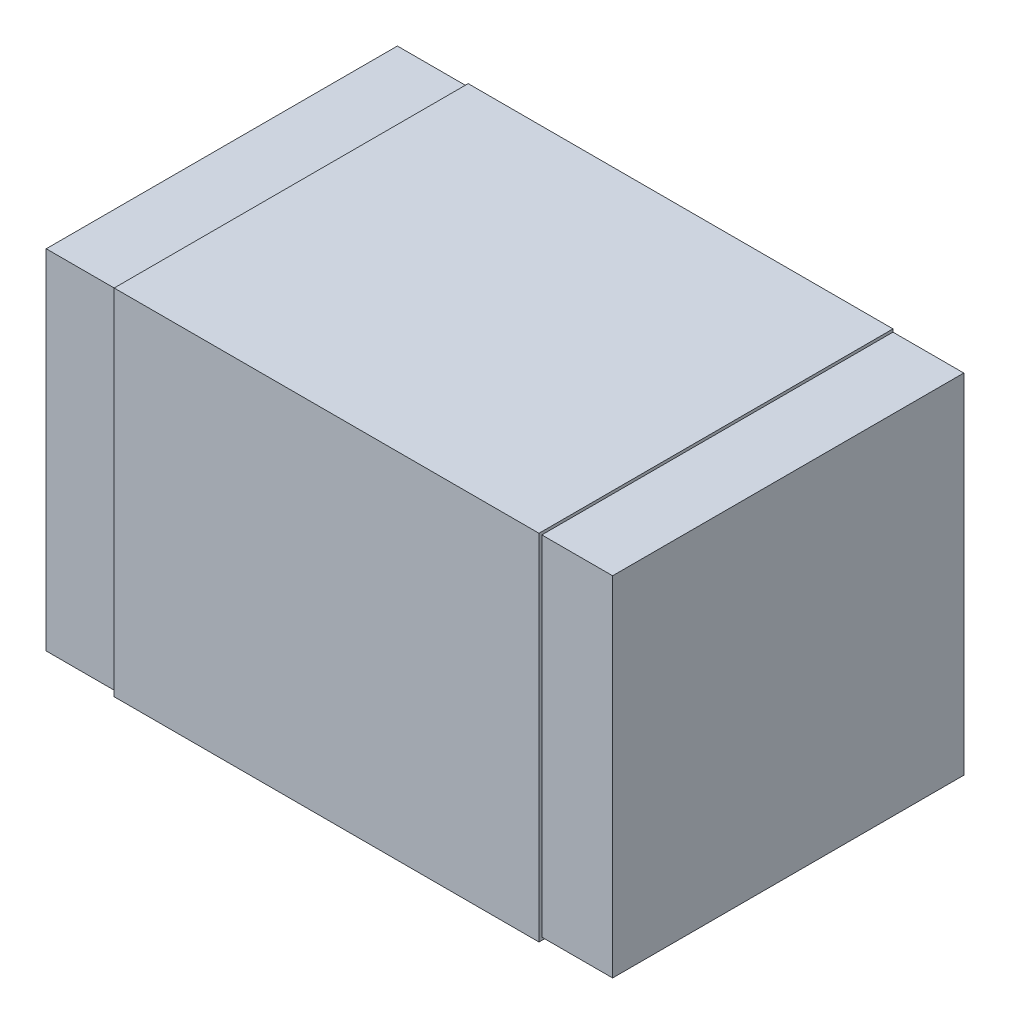
ISO-10303-21;
HEADER;
FILE_DESCRIPTION(('STEP AP214'),'2;1');
FILE_NAME('part.step','',(''),(''),'','','');
FILE_SCHEMA(('AUTOMOTIVE_DESIGN { 1 0 10303 214 1 1 1 1 }'));
ENDSEC;
DATA;
#1=APPLICATION_CONTEXT('core data for automotive mechanical design processes');
#2=APPLICATION_PROTOCOL_DEFINITION('international standard','automotive_design',2000,#1);
#3=PRODUCT_CONTEXT('',#1,'mechanical');
#4=PRODUCT('Part','Part','',(#3));
#5=PRODUCT_RELATED_PRODUCT_CATEGORY('part','',(#4));
#6=PRODUCT_DEFINITION_FORMATION('','',#4);
#7=PRODUCT_DEFINITION_CONTEXT('part definition',#1,'design');
#8=PRODUCT_DEFINITION('design','',#6,#7);
#9=PRODUCT_DEFINITION_SHAPE('','',#8);
#10=(LENGTH_UNIT() NAMED_UNIT(*) SI_UNIT(.MILLI.,.METRE.));
#11=(NAMED_UNIT(*) PLANE_ANGLE_UNIT() SI_UNIT($,.RADIAN.));
#12=(NAMED_UNIT(*) SI_UNIT($,.STERADIAN.) SOLID_ANGLE_UNIT());
#13=UNCERTAINTY_MEASURE_WITH_UNIT(LENGTH_MEASURE(1.E-05),#10,'distance_accuracy_value','');
#14=(GEOMETRIC_REPRESENTATION_CONTEXT(3) GLOBAL_UNCERTAINTY_ASSIGNED_CONTEXT((#13)) GLOBAL_UNIT_ASSIGNED_CONTEXT((#10,
#11,#12)) REPRESENTATION_CONTEXT('',''));
#15=CARTESIAN_POINT('',(0.,0.,0.));
#16=DIRECTION('',(0.,0.,1.));
#17=DIRECTION('',(1.,0.,0.));
#18=AXIS2_PLACEMENT_3D('',#15,#16,#17);
#19=CARTESIAN_POINT('',(-0.75,0.625,1.25));
#20=DIRECTION('',(1.,0.,0.));
#21=DIRECTION('',(0.,1.,0.));
#22=AXIS2_PLACEMENT_3D('',#19,#20,#21);
#23=PLANE('',#22);
#24=DIRECTION('',(0.,0.,-1.));
#25=VECTOR('',#24,1.);
#26=CARTESIAN_POINT('',(-0.75,0.615,1.24));
#27=LINE('',#26,#25);
#28=CARTESIAN_POINT('',(-0.75,0.615,1.24));
#29=VERTEX_POINT('',#28);
#30=CARTESIAN_POINT('',(-0.75,0.615,0.));
#31=VERTEX_POINT('',#30);
#32=EDGE_CURVE('E142',#29,#31,#27,.T.);
#33=ORIENTED_EDGE('',*,*,#32,.F.);
#34=DIRECTION('',(0.,-1.,0.));
#35=VECTOR('',#34,1.);
#36=CARTESIAN_POINT('',(-0.75,0.615,1.24));
#37=LINE('',#36,#35);
#38=CARTESIAN_POINT('',(-0.75,-0.615,1.24));
#39=VERTEX_POINT('',#38);
#40=EDGE_CURVE('E135',#29,#39,#37,.T.);
#41=ORIENTED_EDGE('',*,*,#40,.T.);
#42=DIRECTION('',(0.,0.,-1.));
#43=VECTOR('',#42,1.);
#44=CARTESIAN_POINT('',(-0.75,-0.615,1.24));
#45=LINE('',#44,#43);
#46=CARTESIAN_POINT('',(-0.75,-0.615,0.));
#47=VERTEX_POINT('',#46);
#48=EDGE_CURVE('E121',#39,#47,#45,.T.);
#49=ORIENTED_EDGE('',*,*,#48,.T.);
#50=DIRECTION('',(0.,-1.,0.));
#51=VECTOR('',#50,1.);
#52=CARTESIAN_POINT('',(-0.75,0.625,0.));
#53=LINE('',#52,#51);
#54=CARTESIAN_POINT('',(-0.75,-0.625,0.));
#55=VERTEX_POINT('',#54);
#56=EDGE_CURVE('E202',#47,#55,#53,.T.);
#57=ORIENTED_EDGE('',*,*,#56,.T.);
#58=DIRECTION('',(0.,0.,-1.));
#59=VECTOR('',#58,1.);
#60=CARTESIAN_POINT('',(-0.75,-0.625,1.25));
#61=LINE('',#60,#59);
#62=CARTESIAN_POINT('',(-0.75,-0.625,1.25));
#63=VERTEX_POINT('',#62);
#64=EDGE_CURVE('E208',#63,#55,#61,.T.);
#65=ORIENTED_EDGE('',*,*,#64,.F.);
#66=DIRECTION('',(0.,-1.,0.));
#67=VECTOR('',#66,1.);
#68=CARTESIAN_POINT('',(-0.75,0.625,1.25));
#69=LINE('',#68,#67);
#70=CARTESIAN_POINT('',(-0.75,0.625,1.25));
#71=VERTEX_POINT('',#70);
#72=EDGE_CURVE('E192',#71,#63,#69,.T.);
#73=ORIENTED_EDGE('',*,*,#72,.F.);
#74=DIRECTION('',(0.,0.,-1.));
#75=VECTOR('',#74,1.);
#76=CARTESIAN_POINT('',(-0.75,0.625,1.25));
#77=LINE('',#76,#75);
#78=CARTESIAN_POINT('',(-0.75,0.625,0.));
#79=VERTEX_POINT('',#78);
#80=EDGE_CURVE('E42',#71,#79,#77,.T.);
#81=ORIENTED_EDGE('',*,*,#80,.T.);
#82=EDGE_CURVE('E203',#79,#31,#53,.T.);
#83=ORIENTED_EDGE('',*,*,#82,.T.);
#84=EDGE_LOOP('',(#33,#41,#49,#57,#65,#73,#81,#83));
#85=FACE_BOUND('',#84,.T.);
#86=ADVANCED_FACE('F34',(#85),#23,.F.);
#87=CARTESIAN_POINT('',(0.75,0.625,1.25));
#88=DIRECTION('',(-1.,0.,0.));
#89=DIRECTION('',(0.,-1.,0.));
#90=AXIS2_PLACEMENT_3D('',#87,#88,#89);
#91=PLANE('',#90);
#92=DIRECTION('',(0.,0.,-1.));
#93=VECTOR('',#92,1.);
#94=CARTESIAN_POINT('',(0.75,-0.615,1.24));
#95=LINE('',#94,#93);
#96=CARTESIAN_POINT('',(0.75,-0.615,1.24));
#97=VERTEX_POINT('',#96);
#98=CARTESIAN_POINT('',(0.75,-0.615,0.));
#99=VERTEX_POINT('',#98);
#100=EDGE_CURVE('E178',#97,#99,#95,.T.);
#101=ORIENTED_EDGE('',*,*,#100,.F.);
#102=DIRECTION('',(0.,1.,0.));
#103=VECTOR('',#102,1.);
#104=CARTESIAN_POINT('',(0.75,0.615,1.24));
#105=LINE('',#104,#103);
#106=CARTESIAN_POINT('',(0.75,0.615,1.24));
#107=VERTEX_POINT('',#106);
#108=EDGE_CURVE('E158',#97,#107,#105,.T.);
#109=ORIENTED_EDGE('',*,*,#108,.T.);
#110=DIRECTION('',(0.,0.,-1.));
#111=VECTOR('',#110,1.);
#112=CARTESIAN_POINT('',(0.75,0.615,1.24));
#113=LINE('',#112,#111);
#114=CARTESIAN_POINT('',(0.75,0.615,0.));
#115=VERTEX_POINT('',#114);
#116=EDGE_CURVE('E171',#107,#115,#113,.T.);
#117=ORIENTED_EDGE('',*,*,#116,.T.);
#118=DIRECTION('',(0.,1.,0.));
#119=VECTOR('',#118,1.);
#120=CARTESIAN_POINT('',(0.75,0.625,0.));
#121=LINE('',#120,#119);
#122=CARTESIAN_POINT('',(0.75,0.625,0.));
#123=VERTEX_POINT('',#122);
#124=EDGE_CURVE('E180',#115,#123,#121,.T.);
#125=ORIENTED_EDGE('',*,*,#124,.T.);
#126=DIRECTION('',(0.,0.,-1.));
#127=VECTOR('',#126,1.);
#128=CARTESIAN_POINT('',(0.75,0.625,1.25));
#129=LINE('',#128,#127);
#130=CARTESIAN_POINT('',(0.75,0.625,1.25));
#131=VERTEX_POINT('',#130);
#132=EDGE_CURVE('E11',#131,#123,#129,.T.);
#133=ORIENTED_EDGE('',*,*,#132,.F.);
#134=DIRECTION('',(0.,1.,0.));
#135=VECTOR('',#134,1.);
#136=CARTESIAN_POINT('',(0.75,0.625,1.25));
#137=LINE('',#136,#135);
#138=CARTESIAN_POINT('',(0.75,-0.625,1.25));
#139=VERTEX_POINT('',#138);
#140=EDGE_CURVE('E186',#139,#131,#137,.T.);
#141=ORIENTED_EDGE('',*,*,#140,.F.);
#142=DIRECTION('',(0.,0.,-1.));
#143=VECTOR('',#142,1.);
#144=CARTESIAN_POINT('',(0.75,-0.625,1.25));
#145=LINE('',#144,#143);
#146=CARTESIAN_POINT('',(0.75,-0.625,0.));
#147=VERTEX_POINT('',#146);
#148=EDGE_CURVE('E196',#139,#147,#145,.T.);
#149=ORIENTED_EDGE('',*,*,#148,.T.);
#150=EDGE_CURVE('E197',#147,#99,#121,.T.);
#151=ORIENTED_EDGE('',*,*,#150,.T.);
#152=EDGE_LOOP('',(#101,#109,#117,#125,#133,#141,#149,#151));
#153=FACE_BOUND('',#152,.T.);
#154=ADVANCED_FACE('F36',(#153),#91,.F.);
#155=CARTESIAN_POINT('',(-0.75,0.625,1.25));
#156=DIRECTION('',(0.,-1.,0.));
#157=DIRECTION('',(0.,0.,-1.));
#158=AXIS2_PLACEMENT_3D('',#155,#156,#157);
#159=PLANE('',#158);
#160=DIRECTION('',(-1.,0.,0.));
#161=VECTOR('',#160,1.);
#162=CARTESIAN_POINT('',(-0.75,0.625,0.));
#163=LINE('',#162,#161);
#164=EDGE_CURVE('E200',#123,#79,#163,.T.);
#165=ORIENTED_EDGE('',*,*,#164,.T.);
#166=ORIENTED_EDGE('',*,*,#80,.F.);
#167=DIRECTION('',(-1.,0.,0.));
#168=VECTOR('',#167,1.);
#169=CARTESIAN_POINT('',(-0.75,0.625,1.25));
#170=LINE('',#169,#168);
#171=EDGE_CURVE('E189',#131,#71,#170,.T.);
#172=ORIENTED_EDGE('',*,*,#171,.F.);
#173=ORIENTED_EDGE('',*,*,#132,.T.);
#174=EDGE_LOOP('',(#165,#166,#172,#173));
#175=FACE_BOUND('',#174,.T.);
#176=ADVANCED_FACE('F236',(#175),#159,.F.);
#177=CARTESIAN_POINT('',(-0.75,-0.625,1.25));
#178=DIRECTION('',(0.,1.,0.));
#179=DIRECTION('',(0.,0.,1.));
#180=AXIS2_PLACEMENT_3D('',#177,#178,#179);
#181=PLANE('',#180);
#182=DIRECTION('',(1.,0.,0.));
#183=VECTOR('',#182,1.);
#184=CARTESIAN_POINT('',(-0.75,-0.625,0.));
#185=LINE('',#184,#183);
#186=EDGE_CURVE('E190',#55,#147,#185,.T.);
#187=ORIENTED_EDGE('',*,*,#186,.T.);
#188=ORIENTED_EDGE('',*,*,#148,.F.);
#189=DIRECTION('',(1.,0.,0.));
#190=VECTOR('',#189,1.);
#191=CARTESIAN_POINT('',(-0.75,-0.625,1.25));
#192=LINE('',#191,#190);
#193=EDGE_CURVE('E194',#63,#139,#192,.T.);
#194=ORIENTED_EDGE('',*,*,#193,.F.);
#195=ORIENTED_EDGE('',*,*,#64,.T.);
#196=EDGE_LOOP('',(#187,#188,#194,#195));
#197=FACE_BOUND('',#196,.T.);
#198=ADVANCED_FACE('F230',(#197),#181,.F.);
#199=CARTESIAN_POINT('',(0.,0.,1.25));
#200=DIRECTION('',(0.,0.,1.));
#201=DIRECTION('',(1.,0.,0.));
#202=AXIS2_PLACEMENT_3D('',#199,#200,#201);
#203=PLANE('',#202);
#204=ORIENTED_EDGE('',*,*,#140,.T.);
#205=ORIENTED_EDGE('',*,*,#171,.T.);
#206=ORIENTED_EDGE('',*,*,#72,.T.);
#207=ORIENTED_EDGE('',*,*,#193,.T.);
#208=EDGE_LOOP('',(#204,#205,#206,#207));
#209=FACE_BOUND('',#208,.T.);
#210=ADVANCED_FACE('F234',(#209),#203,.T.);
#211=CARTESIAN_POINT('',(0.,0.,0.));
#212=DIRECTION('',(0.,0.,1.));
#213=DIRECTION('',(1.,0.,0.));
#214=AXIS2_PLACEMENT_3D('',#211,#212,#213);
#215=PLANE('',#214);
#216=ORIENTED_EDGE('',*,*,#150,.F.);
#217=ORIENTED_EDGE('',*,*,#186,.F.);
#218=ORIENTED_EDGE('',*,*,#56,.F.);
#219=DIRECTION('',(-1.,0.,0.));
#220=VECTOR('',#219,1.);
#221=CARTESIAN_POINT('',(-0.75,-0.615,0.));
#222=LINE('',#221,#220);
#223=CARTESIAN_POINT('',(-1.,-0.615,0.));
#224=VERTEX_POINT('',#223);
#225=EDGE_CURVE('E49',#47,#224,#222,.T.);
#226=ORIENTED_EDGE('',*,*,#225,.T.);
#227=DIRECTION('',(0.,1.,0.));
#228=VECTOR('',#227,1.);
#229=CARTESIAN_POINT('',(-1.,0.615,0.));
#230=LINE('',#229,#228);
#231=CARTESIAN_POINT('',(-1.,0.615,0.));
#232=VERTEX_POINT('',#231);
#233=EDGE_CURVE('E146',#224,#232,#230,.T.);
#234=ORIENTED_EDGE('',*,*,#233,.T.);
#235=DIRECTION('',(1.,0.,0.));
#236=VECTOR('',#235,1.);
#237=CARTESIAN_POINT('',(-0.75,0.615,0.));
#238=LINE('',#237,#236);
#239=EDGE_CURVE('E143',#232,#31,#238,.T.);
#240=ORIENTED_EDGE('',*,*,#239,.T.);
#241=ORIENTED_EDGE('',*,*,#82,.F.);
#242=ORIENTED_EDGE('',*,*,#164,.F.);
#243=ORIENTED_EDGE('',*,*,#124,.F.);
#244=DIRECTION('',(1.,0.,0.));
#245=VECTOR('',#244,1.);
#246=CARTESIAN_POINT('',(0.75,0.615,0.));
#247=LINE('',#246,#245);
#248=CARTESIAN_POINT('',(1.,0.615,0.));
#249=VERTEX_POINT('',#248);
#250=EDGE_CURVE('E57',#115,#249,#247,.T.);
#251=ORIENTED_EDGE('',*,*,#250,.T.);
#252=DIRECTION('',(0.,-1.,0.));
#253=VECTOR('',#252,1.);
#254=CARTESIAN_POINT('',(1.,0.615,0.));
#255=LINE('',#254,#253);
#256=CARTESIAN_POINT('',(1.,-0.615,0.));
#257=VERTEX_POINT('',#256);
#258=EDGE_CURVE('E173',#249,#257,#255,.T.);
#259=ORIENTED_EDGE('',*,*,#258,.T.);
#260=DIRECTION('',(-1.,0.,0.));
#261=VECTOR('',#260,1.);
#262=CARTESIAN_POINT('',(0.75,-0.615,0.));
#263=LINE('',#262,#261);
#264=EDGE_CURVE('E162',#257,#99,#263,.T.);
#265=ORIENTED_EDGE('',*,*,#264,.T.);
#266=EDGE_LOOP('',(#216,#217,#218,#226,#234,#240,#241,#242,#243,#251,#259,#265));
#267=FACE_BOUND('',#266,.T.);
#268=ADVANCED_FACE('F219',(#267),#215,.F.);
#269=CARTESIAN_POINT('',(0.75,-0.615,1.24));
#270=DIRECTION('',(0.,-1.,0.));
#271=DIRECTION('',(1.,0.,0.));
#272=AXIS2_PLACEMENT_3D('',#269,#270,#271);
#273=PLANE('',#272);
#274=ORIENTED_EDGE('',*,*,#264,.F.);
#275=DIRECTION('',(0.,0.,-1.));
#276=VECTOR('',#275,1.);
#277=CARTESIAN_POINT('',(1.,-0.615,1.24));
#278=LINE('',#277,#276);
#279=CARTESIAN_POINT('',(1.,-0.615,1.24));
#280=VERTEX_POINT('',#279);
#281=EDGE_CURVE('E181',#280,#257,#278,.T.);
#282=ORIENTED_EDGE('',*,*,#281,.F.);
#283=DIRECTION('',(-1.,0.,0.));
#284=VECTOR('',#283,1.);
#285=CARTESIAN_POINT('',(0.75,-0.615,1.24));
#286=LINE('',#285,#284);
#287=EDGE_CURVE('E168',#280,#97,#286,.T.);
#288=ORIENTED_EDGE('',*,*,#287,.T.);
#289=ORIENTED_EDGE('',*,*,#100,.T.);
#290=EDGE_LOOP('',(#274,#282,#288,#289));
#291=FACE_BOUND('',#290,.T.);
#292=ADVANCED_FACE('F243',(#291),#273,.T.);
#293=CARTESIAN_POINT('',(1.,0.615,1.24));
#294=DIRECTION('',(1.,0.,0.));
#295=DIRECTION('',(0.,1.,0.));
#296=AXIS2_PLACEMENT_3D('',#293,#294,#295);
#297=PLANE('',#296);
#298=ORIENTED_EDGE('',*,*,#258,.F.);
#299=DIRECTION('',(0.,0.,-1.));
#300=VECTOR('',#299,1.);
#301=CARTESIAN_POINT('',(1.,0.615,1.24));
#302=LINE('',#301,#300);
#303=CARTESIAN_POINT('',(1.,0.615,1.24));
#304=VERTEX_POINT('',#303);
#305=EDGE_CURVE('E183',#304,#249,#302,.T.);
#306=ORIENTED_EDGE('',*,*,#305,.F.);
#307=DIRECTION('',(0.,-1.,0.));
#308=VECTOR('',#307,1.);
#309=CARTESIAN_POINT('',(1.,0.615,1.24));
#310=LINE('',#309,#308);
#311=EDGE_CURVE('E165',#304,#280,#310,.T.);
#312=ORIENTED_EDGE('',*,*,#311,.T.);
#313=ORIENTED_EDGE('',*,*,#281,.T.);
#314=EDGE_LOOP('',(#298,#306,#312,#313));
#315=FACE_BOUND('',#314,.T.);
#316=ADVANCED_FACE('F250',(#315),#297,.T.);
#317=CARTESIAN_POINT('',(0.75,0.615,1.24));
#318=DIRECTION('',(0.,1.,0.));
#319=DIRECTION('',(-1.,0.,0.));
#320=AXIS2_PLACEMENT_3D('',#317,#318,#319);
#321=PLANE('',#320);
#322=ORIENTED_EDGE('',*,*,#250,.F.);
#323=ORIENTED_EDGE('',*,*,#116,.F.);
#324=DIRECTION('',(1.,0.,0.));
#325=VECTOR('',#324,1.);
#326=CARTESIAN_POINT('',(0.75,0.615,1.24));
#327=LINE('',#326,#325);
#328=EDGE_CURVE('E161',#107,#304,#327,.T.);
#329=ORIENTED_EDGE('',*,*,#328,.T.);
#330=ORIENTED_EDGE('',*,*,#305,.T.);
#331=EDGE_LOOP('',(#322,#323,#329,#330));
#332=FACE_BOUND('',#331,.T.);
#333=ADVANCED_FACE('F249',(#332),#321,.T.);
#334=CARTESIAN_POINT('',(0.,0.,1.24));
#335=DIRECTION('',(0.,0.,1.));
#336=DIRECTION('',(1.,0.,0.));
#337=AXIS2_PLACEMENT_3D('',#334,#335,#336);
#338=PLANE('',#337);
#339=ORIENTED_EDGE('',*,*,#108,.F.);
#340=ORIENTED_EDGE('',*,*,#287,.F.);
#341=ORIENTED_EDGE('',*,*,#311,.F.);
#342=ORIENTED_EDGE('',*,*,#328,.F.);
#343=EDGE_LOOP('',(#339,#340,#341,#342));
#344=FACE_BOUND('',#343,.T.);
#345=ADVANCED_FACE('F247',(#344),#338,.T.);
#346=CARTESIAN_POINT('',(-0.75,0.615,1.24));
#347=DIRECTION('',(0.,1.,0.));
#348=DIRECTION('',(0.,0.,1.));
#349=AXIS2_PLACEMENT_3D('',#346,#347,#348);
#350=PLANE('',#349);
#351=ORIENTED_EDGE('',*,*,#239,.F.);
#352=DIRECTION('',(0.,0.,-1.));
#353=VECTOR('',#352,1.);
#354=CARTESIAN_POINT('',(-1.,0.615,1.24));
#355=LINE('',#354,#353);
#356=CARTESIAN_POINT('',(-1.,0.615,1.24));
#357=VERTEX_POINT('',#356);
#358=EDGE_CURVE('E155',#357,#232,#355,.T.);
#359=ORIENTED_EDGE('',*,*,#358,.F.);
#360=DIRECTION('',(1.,0.,0.));
#361=VECTOR('',#360,1.);
#362=CARTESIAN_POINT('',(-0.75,0.615,1.24));
#363=LINE('',#362,#361);
#364=EDGE_CURVE('E129',#357,#29,#363,.T.);
#365=ORIENTED_EDGE('',*,*,#364,.T.);
#366=ORIENTED_EDGE('',*,*,#32,.T.);
#367=EDGE_LOOP('',(#351,#359,#365,#366));
#368=FACE_BOUND('',#367,.T.);
#369=ADVANCED_FACE('F224',(#368),#350,.T.);
#370=CARTESIAN_POINT('',(-1.,0.615,1.24));
#371=DIRECTION('',(-1.,0.,0.));
#372=DIRECTION('',(0.,-1.,0.));
#373=AXIS2_PLACEMENT_3D('',#370,#371,#372);
#374=PLANE('',#373);
#375=ORIENTED_EDGE('',*,*,#233,.F.);
#376=DIRECTION('',(0.,0.,-1.));
#377=VECTOR('',#376,1.);
#378=CARTESIAN_POINT('',(-1.,-0.615,1.24));
#379=LINE('',#378,#377);
#380=CARTESIAN_POINT('',(-1.,-0.615,1.24));
#381=VERTEX_POINT('',#380);
#382=EDGE_CURVE('E128',#381,#224,#379,.T.);
#383=ORIENTED_EDGE('',*,*,#382,.F.);
#384=DIRECTION('',(0.,1.,0.));
#385=VECTOR('',#384,1.);
#386=CARTESIAN_POINT('',(-1.,0.615,1.24));
#387=LINE('',#386,#385);
#388=EDGE_CURVE('E138',#381,#357,#387,.T.);
#389=ORIENTED_EDGE('',*,*,#388,.T.);
#390=ORIENTED_EDGE('',*,*,#358,.T.);
#391=EDGE_LOOP('',(#375,#383,#389,#390));
#392=FACE_BOUND('',#391,.T.);
#393=ADVANCED_FACE('F226',(#392),#374,.T.);
#394=CARTESIAN_POINT('',(-0.75,-0.615,1.24));
#395=DIRECTION('',(0.,-1.,0.));
#396=DIRECTION('',(0.,0.,-1.));
#397=AXIS2_PLACEMENT_3D('',#394,#395,#396);
#398=PLANE('',#397);
#399=ORIENTED_EDGE('',*,*,#225,.F.);
#400=ORIENTED_EDGE('',*,*,#48,.F.);
#401=DIRECTION('',(-1.,0.,0.));
#402=VECTOR('',#401,1.);
#403=CARTESIAN_POINT('',(-0.75,-0.615,1.24));
#404=LINE('',#403,#402);
#405=EDGE_CURVE('E124',#39,#381,#404,.T.);
#406=ORIENTED_EDGE('',*,*,#405,.T.);
#407=ORIENTED_EDGE('',*,*,#382,.T.);
#408=EDGE_LOOP('',(#399,#400,#406,#407));
#409=FACE_BOUND('',#408,.T.);
#410=ADVANCED_FACE('F123',(#409),#398,.T.);
#411=CARTESIAN_POINT('',(0.,0.,1.24));
#412=DIRECTION('',(0.,0.,-1.));
#413=DIRECTION('',(-1.,0.,0.));
#414=AXIS2_PLACEMENT_3D('',#411,#412,#413);
#415=PLANE('',#414);
#416=ORIENTED_EDGE('',*,*,#40,.F.);
#417=ORIENTED_EDGE('',*,*,#364,.F.);
#418=ORIENTED_EDGE('',*,*,#388,.F.);
#419=ORIENTED_EDGE('',*,*,#405,.F.);
#420=EDGE_LOOP('',(#416,#417,#418,#419));
#421=FACE_BOUND('',#420,.T.);
#422=ADVANCED_FACE('F133',(#421),#415,.F.);
#423=CLOSED_SHELL('',(#86,#154,#176,#198,#210,#268,#292,#316,#333,#345,#369,#393,#410,#422));
#424=MANIFOLD_SOLID_BREP('B2',#423);
#425=ADVANCED_BREP_SHAPE_REPRESENTATION('',(#18,#424),#14);
#426=SHAPE_DEFINITION_REPRESENTATION(#9,#425);
ENDSEC;
END-ISO-10303-21;
